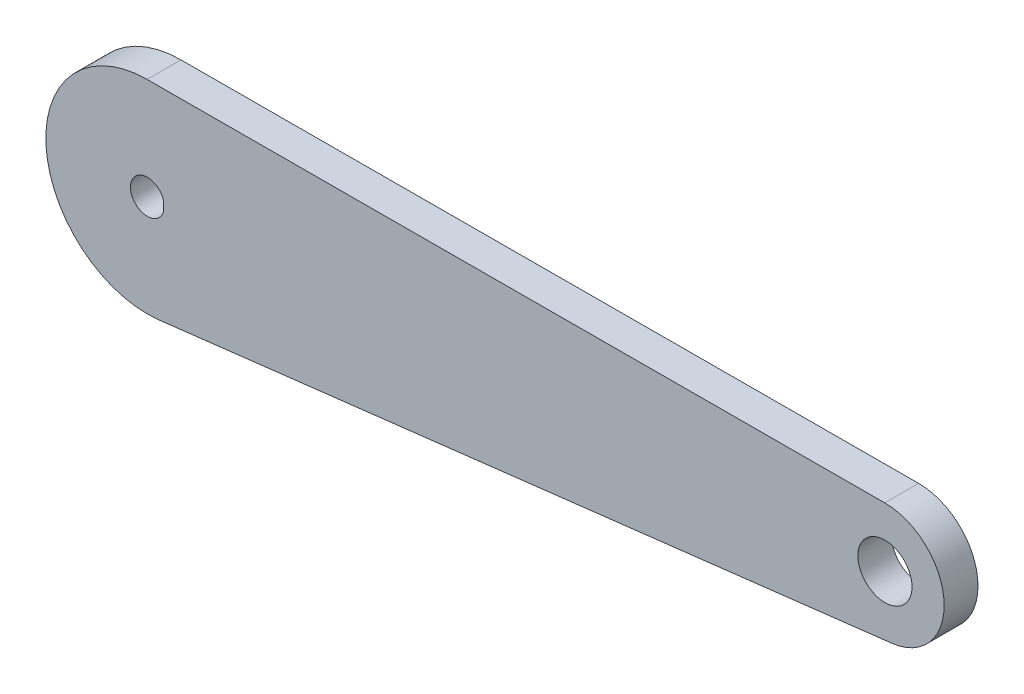
ISO-10303-21;
HEADER;
FILE_DESCRIPTION(('STEP AP214'),'2;1');
FILE_NAME('part.step','',(''),(''),'','','');
FILE_SCHEMA(('AUTOMOTIVE_DESIGN { 1 0 10303 214 1 1 1 1 }'));
ENDSEC;
DATA;
#1=APPLICATION_CONTEXT('core data for automotive mechanical design processes');
#2=APPLICATION_PROTOCOL_DEFINITION('international standard','automotive_design',2000,#1);
#3=PRODUCT_CONTEXT('',#1,'mechanical');
#4=PRODUCT('Part','Part','',(#3));
#5=PRODUCT_RELATED_PRODUCT_CATEGORY('part','',(#4));
#6=PRODUCT_DEFINITION_FORMATION('','',#4);
#7=PRODUCT_DEFINITION_CONTEXT('part definition',#1,'design');
#8=PRODUCT_DEFINITION('design','',#6,#7);
#9=PRODUCT_DEFINITION_SHAPE('','',#8);
#10=(LENGTH_UNIT() NAMED_UNIT(*) SI_UNIT(.MILLI.,.METRE.));
#11=(NAMED_UNIT(*) PLANE_ANGLE_UNIT() SI_UNIT($,.RADIAN.));
#12=(NAMED_UNIT(*) SI_UNIT($,.STERADIAN.) SOLID_ANGLE_UNIT());
#13=UNCERTAINTY_MEASURE_WITH_UNIT(LENGTH_MEASURE(1.E-05),#10,'distance_accuracy_value','');
#14=(GEOMETRIC_REPRESENTATION_CONTEXT(3) GLOBAL_UNCERTAINTY_ASSIGNED_CONTEXT((#13)) GLOBAL_UNIT_ASSIGNED_CONTEXT((#10,
#11,#12)) REPRESENTATION_CONTEXT('',''));
#15=CARTESIAN_POINT('',(0.,0.,0.));
#16=DIRECTION('',(0.,0.,1.));
#17=DIRECTION('',(1.,0.,0.));
#18=AXIS2_PLACEMENT_3D('',#15,#16,#17);
#19=CARTESIAN_POINT('',(0.,0.,5.));
#20=DIRECTION('',(0.,0.,-1.));
#21=DIRECTION('',(-1.,0.,0.));
#22=AXIS2_PLACEMENT_3D('',#19,#20,#21);
#23=CYLINDRICAL_SURFACE('',#22,15.);
#24=CARTESIAN_POINT('',(0.,0.,0.));
#25=DIRECTION('',(0.,0.,1.));
#26=DIRECTION('',(1.,0.,0.));
#27=AXIS2_PLACEMENT_3D('',#24,#25,#26);
#28=CIRCLE('',#27,15.);
#29=CARTESIAN_POINT('',(-0.0427069544372387,14.9999392037449,0.));
#30=VERTEX_POINT('',#29);
#31=CARTESIAN_POINT('',(1.75695957849716,-14.8967477336339,0.));
#32=VERTEX_POINT('',#31);
#33=EDGE_CURVE('E124',#30,#32,#28,.T.);
#34=ORIENTED_EDGE('',*,*,#33,.T.);
#35=DIRECTION('',(0.,0.,-1.));
#36=VECTOR('',#35,1.);
#37=CARTESIAN_POINT('',(1.75695957849716,-14.8967477336339,5.));
#38=LINE('',#37,#36);
#39=CARTESIAN_POINT('',(1.75695957849716,-14.8967477336339,5.));
#40=VERTEX_POINT('',#39);
#41=EDGE_CURVE('E12',#40,#32,#38,.T.);
#42=ORIENTED_EDGE('',*,*,#41,.F.);
#43=CARTESIAN_POINT('',(0.,0.,5.));
#44=DIRECTION('',(0.,0.,1.));
#45=DIRECTION('',(1.,0.,0.));
#46=AXIS2_PLACEMENT_3D('',#43,#44,#45);
#47=CIRCLE('',#46,15.);
#48=CARTESIAN_POINT('',(-0.0427069544372387,14.9999392037449,5.));
#49=VERTEX_POINT('',#48);
#50=EDGE_CURVE('E133',#49,#40,#47,.T.);
#51=ORIENTED_EDGE('',*,*,#50,.F.);
#52=DIRECTION('',(0.,0.,-1.));
#53=VECTOR('',#52,1.);
#54=CARTESIAN_POINT('',(-0.0427069544372387,14.9999392037449,5.));
#55=LINE('',#54,#53);
#56=EDGE_CURVE('E148',#49,#30,#55,.T.);
#57=ORIENTED_EDGE('',*,*,#56,.T.);
#58=EDGE_LOOP('',(#34,#42,#51,#57));
#59=FACE_BOUND('',#58,.T.);
#60=ADVANCED_FACE('F48',(#59),#23,.T.);
#61=CARTESIAN_POINT('',(1.75695957849716,-14.8967477336339,5.));
#62=DIRECTION('',(-0.117130638566477,0.993116515575594,0.));
#63=DIRECTION('',(-0.993116515575594,-0.117130638566477,0.));
#64=AXIS2_PLACEMENT_3D('',#61,#62,#63);
#65=PLANE('',#64);
#66=DIRECTION('',(0.993116515575594,0.117130638566477,0.));
#67=VECTOR('',#66,1.);
#68=CARTESIAN_POINT('',(1.75695957849716,-14.8967477336339,0.));
#69=LINE('',#68,#67);
#70=CARTESIAN_POINT('',(110.007098523108,-2.12945638298689,0.));
#71=VERTEX_POINT('',#70);
#72=EDGE_CURVE('E152',#32,#71,#69,.T.);
#73=ORIENTED_EDGE('',*,*,#72,.T.);
#74=DIRECTION('',(0.,0.,-1.));
#75=VECTOR('',#74,1.);
#76=CARTESIAN_POINT('',(110.007098523108,-2.12945638298689,5.));
#77=LINE('',#76,#75);
#78=CARTESIAN_POINT('',(110.007098523108,-2.12945638298689,5.));
#79=VERTEX_POINT('',#78);
#80=EDGE_CURVE('E56',#79,#71,#77,.T.);
#81=ORIENTED_EDGE('',*,*,#80,.F.);
#82=DIRECTION('',(0.993116515575594,0.117130638566477,0.));
#83=VECTOR('',#82,1.);
#84=CARTESIAN_POINT('',(1.75695957849716,-14.8967477336339,5.));
#85=LINE('',#84,#83);
#86=EDGE_CURVE('E137',#40,#79,#85,.T.);
#87=ORIENTED_EDGE('',*,*,#86,.F.);
#88=ORIENTED_EDGE('',*,*,#41,.T.);
#89=EDGE_LOOP('',(#73,#81,#87,#88));
#90=FACE_BOUND('',#89,.T.);
#91=ADVANCED_FACE('F185',(#90),#65,.F.);
#92=CARTESIAN_POINT('',(108.982205435651,6.56031312829872,5.));
#93=DIRECTION('',(0.,0.,-1.));
#94=DIRECTION('',(-1.,0.,0.));
#95=AXIS2_PLACEMENT_3D('',#92,#93,#94);
#96=CYLINDRICAL_SURFACE('',#95,8.7499999999983);
#97=CARTESIAN_POINT('',(108.982205435651,6.56031312829872,0.));
#98=DIRECTION('',(0.,0.,1.));
#99=DIRECTION('',(1.,0.,0.));
#100=AXIS2_PLACEMENT_3D('',#97,#98,#99);
#101=CIRCLE('',#100,8.7499999999983);
#102=CARTESIAN_POINT('',(108.957293045563,15.3102776638157,0.));
#103=VERTEX_POINT('',#102);
#104=EDGE_CURVE('E155',#71,#103,#101,.T.);
#105=ORIENTED_EDGE('',*,*,#104,.T.);
#106=DIRECTION('',(0.,0.,-1.));
#107=VECTOR('',#106,1.);
#108=CARTESIAN_POINT('',(108.957293045563,15.3102776638157,5.));
#109=LINE('',#108,#107);
#110=CARTESIAN_POINT('',(108.957293045563,15.3102776638157,5.));
#111=VERTEX_POINT('',#110);
#112=EDGE_CURVE('E164',#111,#103,#109,.T.);
#113=ORIENTED_EDGE('',*,*,#112,.F.);
#114=CARTESIAN_POINT('',(108.982205435651,6.56031312829872,5.));
#115=DIRECTION('',(0.,0.,1.));
#116=DIRECTION('',(1.,0.,0.));
#117=AXIS2_PLACEMENT_3D('',#114,#115,#116);
#118=CIRCLE('',#117,8.7499999999983);
#119=EDGE_CURVE('E141',#79,#111,#118,.T.);
#120=ORIENTED_EDGE('',*,*,#119,.F.);
#121=ORIENTED_EDGE('',*,*,#80,.T.);
#122=EDGE_LOOP('',(#105,#113,#120,#121));
#123=FACE_BOUND('',#122,.T.);
#124=ADVANCED_FACE('F172',(#123),#96,.T.);
#125=CARTESIAN_POINT('',(-0.0427069544372387,14.9999392037449,5.));
#126=DIRECTION('',(-0.00284713029581591,0.999995946916326,0.));
#127=DIRECTION('',(-0.999995946916326,-0.00284713029581591,0.));
#128=AXIS2_PLACEMENT_3D('',#125,#126,#127);
#129=PLANE('',#128);
#130=DIRECTION('',(0.999995946916326,0.00284713029581591,0.));
#131=VECTOR('',#130,1.);
#132=CARTESIAN_POINT('',(-0.0427069544372387,14.9999392037449,0.));
#133=LINE('',#132,#131);
#134=EDGE_CURVE('E138',#30,#103,#133,.T.);
#135=ORIENTED_EDGE('',*,*,#134,.F.);
#136=ORIENTED_EDGE('',*,*,#56,.F.);
#137=DIRECTION('',(0.999995946916326,0.00284713029581591,0.));
#138=VECTOR('',#137,1.);
#139=CARTESIAN_POINT('',(-0.0427069544372387,14.9999392037449,5.));
#140=LINE('',#139,#138);
#141=EDGE_CURVE('E144',#49,#111,#140,.T.);
#142=ORIENTED_EDGE('',*,*,#141,.T.);
#143=ORIENTED_EDGE('',*,*,#112,.T.);
#144=EDGE_LOOP('',(#135,#136,#142,#143));
#145=FACE_BOUND('',#144,.T.);
#146=ADVANCED_FACE('F179',(#145),#129,.T.);
#147=CARTESIAN_POINT('',(0.,0.,5.));
#148=DIRECTION('',(0.,0.,1.));
#149=DIRECTION('',(1.,0.,0.));
#150=AXIS2_PLACEMENT_3D('',#147,#148,#149);
#151=PLANE('',#150);
#152=CARTESIAN_POINT('',(0.,0.,5.));
#153=DIRECTION('',(0.,0.,1.));
#154=DIRECTION('',(1.,0.,0.));
#155=AXIS2_PLACEMENT_3D('',#152,#153,#154);
#156=CIRCLE('',#155,2.5);
#157=CARTESIAN_POINT('',(2.4,0.700000000000001,5.));
#158=VERTEX_POINT('',#157);
#159=CARTESIAN_POINT('',(2.4,-0.700000000000001,5.));
#160=VERTEX_POINT('',#159);
#161=EDGE_CURVE('E63',#158,#160,#156,.T.);
#162=ORIENTED_EDGE('',*,*,#161,.F.);
#163=DIRECTION('',(0.,1.,0.));
#164=VECTOR('',#163,1.);
#165=CARTESIAN_POINT('',(2.4,0.,5.));
#166=LINE('',#165,#164);
#167=EDGE_CURVE('E115',#160,#158,#166,.T.);
#168=ORIENTED_EDGE('',*,*,#167,.F.);
#169=EDGE_LOOP('',(#162,#168));
#170=FACE_BOUND('',#169,.T.);
#171=CARTESIAN_POINT('',(108.982205435651,6.56031312829872,5.));
#172=DIRECTION('',(0.,0.,1.));
#173=DIRECTION('',(1.,0.,0.));
#174=AXIS2_PLACEMENT_3D('',#171,#172,#173);
#175=CIRCLE('',#174,4.00000000000001);
#176=CARTESIAN_POINT('',(112.982205435651,6.56031312829872,5.));
#177=VERTEX_POINT('',#176);
#178=EDGE_CURVE('E129',#177,#177,#175,.T.);
#179=ORIENTED_EDGE('',*,*,#178,.F.);
#180=EDGE_LOOP('',(#179));
#181=FACE_BOUND('',#180,.T.);
#182=ORIENTED_EDGE('',*,*,#50,.T.);
#183=ORIENTED_EDGE('',*,*,#86,.T.);
#184=ORIENTED_EDGE('',*,*,#119,.T.);
#185=ORIENTED_EDGE('',*,*,#141,.F.);
#186=EDGE_LOOP('',(#182,#183,#184,#185));
#187=FACE_BOUND('',#186,.T.);
#188=ADVANCED_FACE('F183',(#170,#181,#187),#151,.T.);
#189=CARTESIAN_POINT('',(0.,0.,0.));
#190=DIRECTION('',(0.,0.,1.));
#191=DIRECTION('',(1.,0.,0.));
#192=AXIS2_PLACEMENT_3D('',#189,#190,#191);
#193=PLANE('',#192);
#194=DIRECTION('',(0.,1.,0.));
#195=VECTOR('',#194,1.);
#196=CARTESIAN_POINT('',(2.4,0.,0.));
#197=LINE('',#196,#195);
#198=CARTESIAN_POINT('',(2.4,-0.700000000000001,0.));
#199=VERTEX_POINT('',#198);
#200=CARTESIAN_POINT('',(2.4,0.700000000000001,0.));
#201=VERTEX_POINT('',#200);
#202=EDGE_CURVE('E105',#199,#201,#197,.T.);
#203=ORIENTED_EDGE('',*,*,#202,.T.);
#204=CARTESIAN_POINT('',(0.,0.,0.));
#205=DIRECTION('',(0.,0.,1.));
#206=DIRECTION('',(1.,0.,0.));
#207=AXIS2_PLACEMENT_3D('',#204,#205,#206);
#208=CIRCLE('',#207,2.5);
#209=EDGE_CURVE('E68',#201,#199,#208,.T.);
#210=ORIENTED_EDGE('',*,*,#209,.T.);
#211=EDGE_LOOP('',(#203,#210));
#212=FACE_BOUND('',#211,.T.);
#213=CARTESIAN_POINT('',(108.982205435651,6.56031312829872,0.));
#214=DIRECTION('',(0.,0.,1.));
#215=DIRECTION('',(1.,0.,0.));
#216=AXIS2_PLACEMENT_3D('',#213,#214,#215);
#217=CIRCLE('',#216,4.00000000000001);
#218=CARTESIAN_POINT('',(112.982205435651,6.56031312829872,0.));
#219=VERTEX_POINT('',#218);
#220=EDGE_CURVE('E121',#219,#219,#217,.T.);
#221=ORIENTED_EDGE('',*,*,#220,.T.);
#222=EDGE_LOOP('',(#221));
#223=FACE_BOUND('',#222,.T.);
#224=ORIENTED_EDGE('',*,*,#33,.F.);
#225=ORIENTED_EDGE('',*,*,#134,.T.);
#226=ORIENTED_EDGE('',*,*,#104,.F.);
#227=ORIENTED_EDGE('',*,*,#72,.F.);
#228=EDGE_LOOP('',(#224,#225,#226,#227));
#229=FACE_BOUND('',#228,.T.);
#230=ADVANCED_FACE('F112',(#212,#223,#229),#193,.F.);
#231=CARTESIAN_POINT('',(108.982205435651,6.56031312829872,0.));
#232=DIRECTION('',(0.,0.,1.));
#233=DIRECTION('',(1.,0.,0.));
#234=AXIS2_PLACEMENT_3D('',#231,#232,#233);
#235=CYLINDRICAL_SURFACE('',#234,4.00000000000001);
#236=ORIENTED_EDGE('',*,*,#220,.F.);
#237=EDGE_LOOP('',(#236));
#238=FACE_BOUND('',#237,.T.);
#239=ORIENTED_EDGE('',*,*,#178,.T.);
#240=EDGE_LOOP('',(#239));
#241=FACE_BOUND('',#240,.T.);
#242=ADVANCED_FACE('F200',(#238,#241),#235,.F.);
#243=CARTESIAN_POINT('',(0.,0.,0.));
#244=DIRECTION('',(0.,0.,1.));
#245=DIRECTION('',(1.,0.,0.));
#246=AXIS2_PLACEMENT_3D('',#243,#244,#245);
#247=CYLINDRICAL_SURFACE('',#246,2.5);
#248=ORIENTED_EDGE('',*,*,#161,.T.);
#249=DIRECTION('',(0.,0.,1.));
#250=VECTOR('',#249,1.);
#251=CARTESIAN_POINT('',(2.4,-0.700000000000001,0.));
#252=LINE('',#251,#250);
#253=EDGE_CURVE('E97',#199,#160,#252,.T.);
#254=ORIENTED_EDGE('',*,*,#253,.F.);
#255=ORIENTED_EDGE('',*,*,#209,.F.);
#256=DIRECTION('',(0.,0.,1.));
#257=VECTOR('',#256,1.);
#258=CARTESIAN_POINT('',(2.4,0.700000000000001,0.));
#259=LINE('',#258,#257);
#260=EDGE_CURVE('E104',#201,#158,#259,.T.);
#261=ORIENTED_EDGE('',*,*,#260,.T.);
#262=EDGE_LOOP('',(#248,#254,#255,#261));
#263=FACE_BOUND('',#262,.T.);
#264=ADVANCED_FACE('F99',(#263),#247,.F.);
#265=CARTESIAN_POINT('',(2.4,0.,0.));
#266=DIRECTION('',(1.,0.,0.));
#267=DIRECTION('',(0.,0.,-1.));
#268=AXIS2_PLACEMENT_3D('',#265,#266,#267);
#269=PLANE('',#268);
#270=ORIENTED_EDGE('',*,*,#167,.T.);
#271=ORIENTED_EDGE('',*,*,#260,.F.);
#272=ORIENTED_EDGE('',*,*,#202,.F.);
#273=ORIENTED_EDGE('',*,*,#253,.T.);
#274=EDGE_LOOP('',(#270,#271,#272,#273));
#275=FACE_BOUND('',#274,.T.);
#276=ADVANCED_FACE('F108',(#275),#269,.F.);
#277=CLOSED_SHELL('',(#60,#91,#124,#146,#188,#230,#242,#264,#276));
#278=MANIFOLD_SOLID_BREP('B2',#277);
#279=ADVANCED_BREP_SHAPE_REPRESENTATION('',(#18,#278),#14);
#280=SHAPE_DEFINITION_REPRESENTATION(#9,#279);
ENDSEC;
END-ISO-10303-21;
